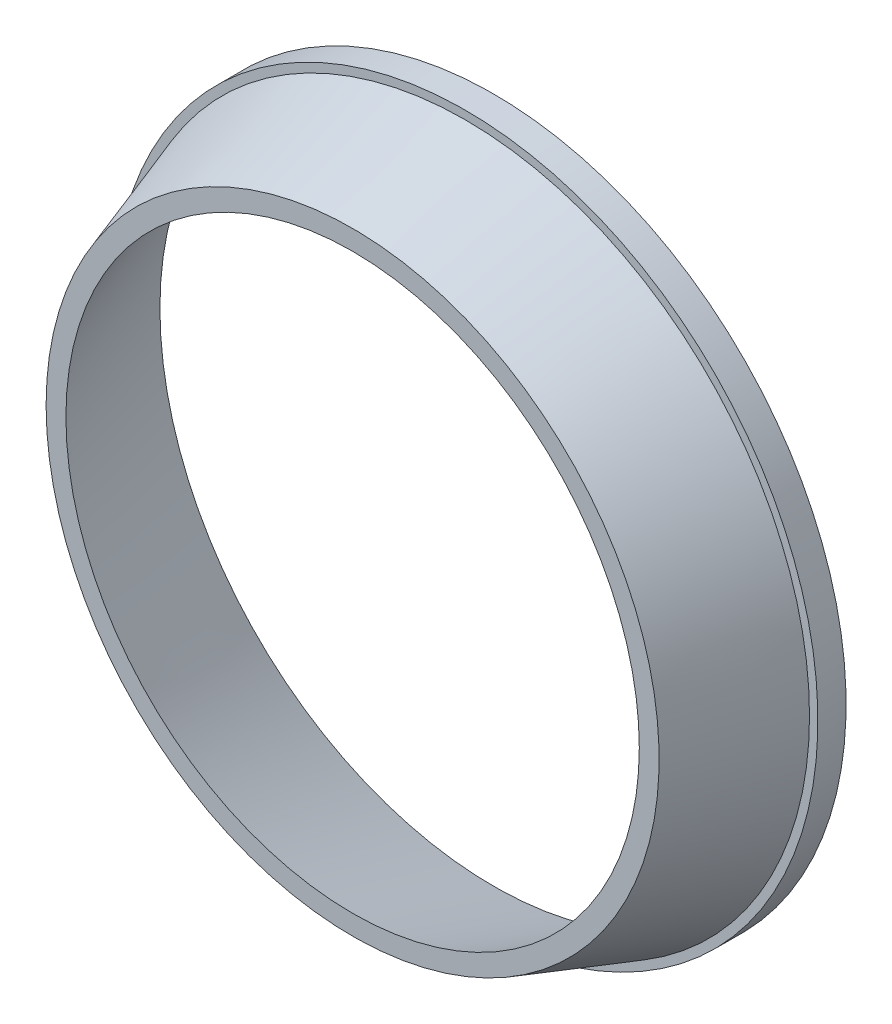
ISO-10303-21;
HEADER;
FILE_DESCRIPTION(('STEP AP214'),'2;1');
FILE_NAME('part.step','',(''),(''),'','','');
FILE_SCHEMA(('AUTOMOTIVE_DESIGN { 1 0 10303 214 1 1 1 1 }'));
ENDSEC;
DATA;
#1=APPLICATION_CONTEXT('core data for automotive mechanical design processes');
#2=APPLICATION_PROTOCOL_DEFINITION('international standard','automotive_design',2000,#1);
#3=PRODUCT_CONTEXT('',#1,'mechanical');
#4=PRODUCT('Part','Part','',(#3));
#5=PRODUCT_RELATED_PRODUCT_CATEGORY('part','',(#4));
#6=PRODUCT_DEFINITION_FORMATION('','',#4);
#7=PRODUCT_DEFINITION_CONTEXT('part definition',#1,'design');
#8=PRODUCT_DEFINITION('design','',#6,#7);
#9=PRODUCT_DEFINITION_SHAPE('','',#8);
#10=(LENGTH_UNIT() NAMED_UNIT(*) SI_UNIT(.MILLI.,.METRE.));
#11=(NAMED_UNIT(*) PLANE_ANGLE_UNIT() SI_UNIT($,.RADIAN.));
#12=(NAMED_UNIT(*) SI_UNIT($,.STERADIAN.) SOLID_ANGLE_UNIT());
#13=UNCERTAINTY_MEASURE_WITH_UNIT(LENGTH_MEASURE(1.E-05),#10,'distance_accuracy_value','');
#14=(GEOMETRIC_REPRESENTATION_CONTEXT(3) GLOBAL_UNCERTAINTY_ASSIGNED_CONTEXT((#13)) GLOBAL_UNIT_ASSIGNED_CONTEXT((#10,
#11,#12)) REPRESENTATION_CONTEXT('',''));
#15=CARTESIAN_POINT('',(0.,0.,0.));
#16=DIRECTION('',(0.,0.,1.));
#17=DIRECTION('',(1.,0.,0.));
#18=AXIS2_PLACEMENT_3D('',#15,#16,#17);
#19=CARTESIAN_POINT('',(0.,0.,3.));
#20=DIRECTION('',(0.,0.,1.));
#21=DIRECTION('',(1.,0.,0.));
#22=AXIS2_PLACEMENT_3D('',#19,#20,#21);
#23=PLANE('',#22);
#24=CARTESIAN_POINT('',(0.,0.,3.));
#25=DIRECTION('',(0.,0.,-1.));
#26=DIRECTION('',(-1.,0.,0.));
#27=AXIS2_PLACEMENT_3D('',#24,#25,#26);
#28=CIRCLE('',#27,36.6081851067789);
#29=CARTESIAN_POINT('',(-36.6081851067789,0.,3.));
#30=VERTEX_POINT('',#29);
#31=EDGE_CURVE('E70',#30,#30,#28,.T.);
#32=ORIENTED_EDGE('',*,*,#31,.T.);
#33=EDGE_LOOP('',(#32));
#34=FACE_BOUND('',#33,.T.);
#35=CARTESIAN_POINT('',(0.,0.,3.));
#36=DIRECTION('',(0.,0.,-1.));
#37=DIRECTION('',(-1.,0.,0.));
#38=AXIS2_PLACEMENT_3D('',#35,#36,#37);
#39=CIRCLE('',#38,37.5);
#40=CARTESIAN_POINT('',(-37.5,0.,3.));
#41=VERTEX_POINT('',#40);
#42=EDGE_CURVE('E10',#41,#41,#39,.T.);
#43=ORIENTED_EDGE('',*,*,#42,.F.);
#44=EDGE_LOOP('',(#43));
#45=FACE_BOUND('',#44,.T.);
#46=ADVANCED_FACE('F43',(#34,#45),#23,.T.);
#47=CARTESIAN_POINT('',(0.,0.,0.));
#48=DIRECTION('',(0.,0.,-1.));
#49=DIRECTION('',(-1.,0.,0.));
#50=AXIS2_PLACEMENT_3D('',#47,#48,#49);
#51=CYLINDRICAL_SURFACE('',#50,37.5);
#52=ORIENTED_EDGE('',*,*,#42,.T.);
#53=EDGE_LOOP('',(#52));
#54=FACE_BOUND('',#53,.T.);
#55=CARTESIAN_POINT('',(0.,0.,0.));
#56=DIRECTION('',(0.,0.,-1.));
#57=DIRECTION('',(-1.,0.,0.));
#58=AXIS2_PLACEMENT_3D('',#55,#56,#57);
#59=CIRCLE('',#58,37.5);
#60=CARTESIAN_POINT('',(-37.5,0.,0.));
#61=VERTEX_POINT('',#60);
#62=EDGE_CURVE('E50',#61,#61,#59,.T.);
#63=ORIENTED_EDGE('',*,*,#62,.F.);
#64=EDGE_LOOP('',(#63));
#65=FACE_BOUND('',#64,.T.);
#66=ADVANCED_FACE('F97',(#54,#65),#51,.T.);
#67=CARTESIAN_POINT('',(0.,0.,0.));
#68=DIRECTION('',(0.,0.,-1.));
#69=DIRECTION('',(-1.,0.,0.));
#70=AXIS2_PLACEMENT_3D('',#67,#68,#69);
#71=PLANE('',#70);
#72=ORIENTED_EDGE('',*,*,#62,.T.);
#73=EDGE_LOOP('',(#72));
#74=FACE_BOUND('',#73,.T.);
#75=CARTESIAN_POINT('',(0.,0.,0.));
#76=DIRECTION('',(0.,0.,-1.));
#77=DIRECTION('',(-1.,0.,0.));
#78=AXIS2_PLACEMENT_3D('',#75,#76,#77);
#79=CIRCLE('',#78,35.5);
#80=CARTESIAN_POINT('',(-35.5,0.,0.));
#81=VERTEX_POINT('',#80);
#82=EDGE_CURVE('E55',#81,#81,#79,.T.);
#83=ORIENTED_EDGE('',*,*,#82,.F.);
#84=EDGE_LOOP('',(#83));
#85=FACE_BOUND('',#84,.T.);
#86=ADVANCED_FACE('F91',(#74,#85),#71,.T.);
#87=CARTESIAN_POINT('',(0.,0.,15.));
#88=DIRECTION('',(0.,0.,-1.));
#89=DIRECTION('',(-1.,0.,0.));
#90=AXIS2_PLACEMENT_3D('',#87,#88,#89);
#91=CONICAL_SURFACE('',#90,30.5,0.321750554396642);
#92=ORIENTED_EDGE('',*,*,#82,.T.);
#93=EDGE_LOOP('',(#92));
#94=FACE_BOUND('',#93,.T.);
#95=CARTESIAN_POINT('',(0.,0.,15.));
#96=DIRECTION('',(0.,0.,-1.));
#97=DIRECTION('',(-1.,0.,0.));
#98=AXIS2_PLACEMENT_3D('',#95,#96,#97);
#99=CIRCLE('',#98,30.5);
#100=CARTESIAN_POINT('',(-30.5,0.,15.));
#101=VERTEX_POINT('',#100);
#102=EDGE_CURVE('E60',#101,#101,#99,.T.);
#103=ORIENTED_EDGE('',*,*,#102,.F.);
#104=EDGE_LOOP('',(#103));
#105=FACE_BOUND('',#104,.T.);
#106=ADVANCED_FACE('F86',(#94,#105),#91,.F.);
#107=CARTESIAN_POINT('',(0.,0.,15.));
#108=DIRECTION('',(0.,0.,-1.));
#109=DIRECTION('',(-1.,0.,0.));
#110=AXIS2_PLACEMENT_3D('',#107,#108,#109);
#111=PLANE('',#110);
#112=CARTESIAN_POINT('',(0.,0.,15.));
#113=DIRECTION('',(0.,0.,-1.));
#114=DIRECTION('',(-1.,0.,0.));
#115=AXIS2_PLACEMENT_3D('',#112,#113,#114);
#116=CIRCLE('',#115,32.6081851067789);
#117=CARTESIAN_POINT('',(-32.6081851067789,0.,15.));
#118=VERTEX_POINT('',#117);
#119=EDGE_CURVE('E66',#118,#118,#116,.T.);
#120=ORIENTED_EDGE('',*,*,#119,.F.);
#121=EDGE_LOOP('',(#120));
#122=FACE_BOUND('',#121,.T.);
#123=ORIENTED_EDGE('',*,*,#102,.T.);
#124=EDGE_LOOP('',(#123));
#125=FACE_BOUND('',#124,.T.);
#126=ADVANCED_FACE('F80',(#122,#125),#111,.F.);
#127=CARTESIAN_POINT('',(0.,0.,15.));
#128=DIRECTION('',(0.,0.,-1.));
#129=DIRECTION('',(-1.,0.,0.));
#130=AXIS2_PLACEMENT_3D('',#127,#128,#129);
#131=CONICAL_SURFACE('',#130,32.6081851067789,0.321750554396641);
#132=ORIENTED_EDGE('',*,*,#31,.F.);
#133=EDGE_LOOP('',(#132));
#134=FACE_BOUND('',#133,.T.);
#135=ORIENTED_EDGE('',*,*,#119,.T.);
#136=EDGE_LOOP('',(#135));
#137=FACE_BOUND('',#136,.T.);
#138=ADVANCED_FACE('F77',(#134,#137),#131,.T.);
#139=CLOSED_SHELL('',(#46,#66,#86,#106,#126,#138));
#140=MANIFOLD_SOLID_BREP('B2',#139);
#141=ADVANCED_BREP_SHAPE_REPRESENTATION('',(#18,#140),#14);
#142=SHAPE_DEFINITION_REPRESENTATION(#9,#141);
ENDSEC;
END-ISO-10303-21;
